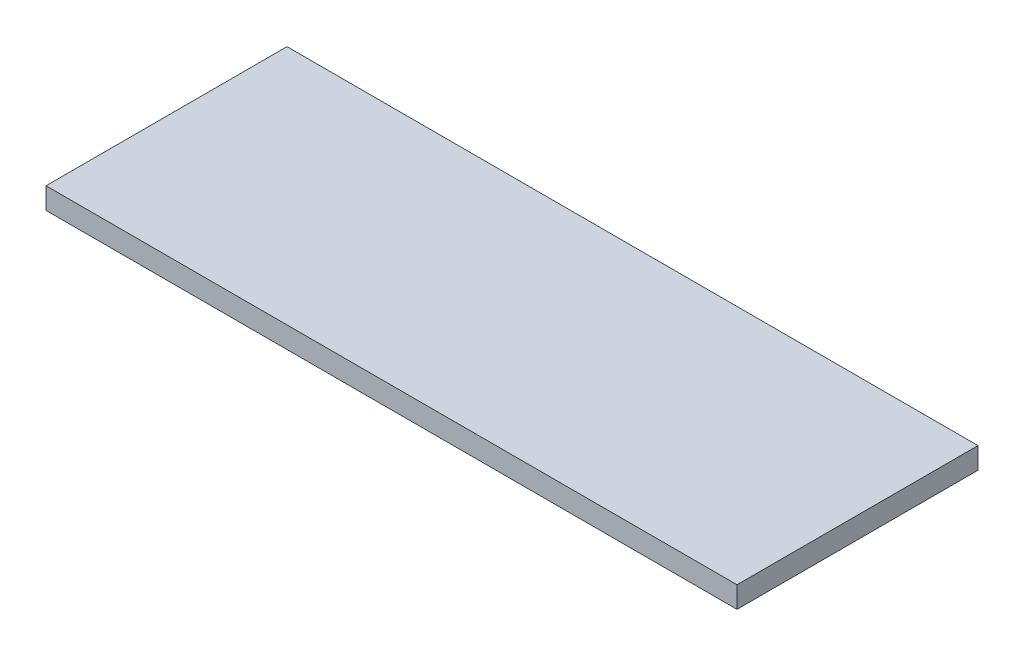
ISO-10303-21;
HEADER;
FILE_DESCRIPTION(('STEP AP214'),'2;1');
FILE_NAME('part.step','',(''),(''),'','','');
FILE_SCHEMA(('AUTOMOTIVE_DESIGN { 1 0 10303 214 1 1 1 1 }'));
ENDSEC;
DATA;
#1=APPLICATION_CONTEXT('core data for automotive mechanical design processes');
#2=APPLICATION_PROTOCOL_DEFINITION('international standard','automotive_design',2000,#1);
#3=PRODUCT_CONTEXT('',#1,'mechanical');
#4=PRODUCT('Part','Part','',(#3));
#5=PRODUCT_RELATED_PRODUCT_CATEGORY('part','',(#4));
#6=PRODUCT_DEFINITION_FORMATION('','',#4);
#7=PRODUCT_DEFINITION_CONTEXT('part definition',#1,'design');
#8=PRODUCT_DEFINITION('design','',#6,#7);
#9=PRODUCT_DEFINITION_SHAPE('','',#8);
#10=(LENGTH_UNIT() NAMED_UNIT(*) SI_UNIT(.MILLI.,.METRE.));
#11=(NAMED_UNIT(*) PLANE_ANGLE_UNIT() SI_UNIT($,.RADIAN.));
#12=(NAMED_UNIT(*) SI_UNIT($,.STERADIAN.) SOLID_ANGLE_UNIT());
#13=UNCERTAINTY_MEASURE_WITH_UNIT(LENGTH_MEASURE(1.E-05),#10,'distance_accuracy_value','');
#14=(GEOMETRIC_REPRESENTATION_CONTEXT(3) GLOBAL_UNCERTAINTY_ASSIGNED_CONTEXT((#13)) GLOBAL_UNIT_ASSIGNED_CONTEXT((#10,
#11,#12)) REPRESENTATION_CONTEXT('',''));
#15=CARTESIAN_POINT('',(0.,0.,0.));
#16=DIRECTION('',(0.,0.,1.));
#17=DIRECTION('',(1.,0.,0.));
#18=AXIS2_PLACEMENT_3D('',#15,#16,#17);
#19=CARTESIAN_POINT('',(-15.7888785046729,0.974490445680522,-4.81528037383178));
#20=DIRECTION('',(1.,0.,0.));
#21=DIRECTION('',(0.,0.,-1.));
#22=AXIS2_PLACEMENT_3D('',#19,#20,#21);
#23=PLANE('',#22);
#24=DIRECTION('',(0.,0.,1.));
#25=VECTOR('',#24,1.);
#26=CARTESIAN_POINT('',(-15.7888785046729,0.,-4.81528037383178));
#27=LINE('',#26,#25);
#28=CARTESIAN_POINT('',(-15.7888785046729,0.,-4.81528037383178));
#29=VERTEX_POINT('',#28);
#30=CARTESIAN_POINT('',(-15.7888785046729,0.,6.19471962616822));
#31=VERTEX_POINT('',#30);
#32=EDGE_CURVE('E100',#29,#31,#27,.T.);
#33=ORIENTED_EDGE('',*,*,#32,.T.);
#34=DIRECTION('',(0.,-1.,0.));
#35=VECTOR('',#34,1.);
#36=CARTESIAN_POINT('',(-15.7888785046729,0.974490445680522,6.19471962616822));
#37=LINE('',#36,#35);
#38=CARTESIAN_POINT('',(-15.7888785046729,0.974490445680522,6.19471962616822));
#39=VERTEX_POINT('',#38);
#40=EDGE_CURVE('E11',#39,#31,#37,.T.);
#41=ORIENTED_EDGE('',*,*,#40,.F.);
#42=DIRECTION('',(0.,0.,1.));
#43=VECTOR('',#42,1.);
#44=CARTESIAN_POINT('',(-15.7888785046729,0.974490445680522,-4.81528037383178));
#45=LINE('',#44,#43);
#46=CARTESIAN_POINT('',(-15.7888785046729,0.974490445680522,-4.81528037383178));
#47=VERTEX_POINT('',#46);
#48=EDGE_CURVE('E88',#47,#39,#45,.T.);
#49=ORIENTED_EDGE('',*,*,#48,.F.);
#50=DIRECTION('',(0.,-1.,0.));
#51=VECTOR('',#50,1.);
#52=CARTESIAN_POINT('',(-15.7888785046729,0.974490445680522,-4.81528037383178));
#53=LINE('',#52,#51);
#54=EDGE_CURVE('E96',#47,#29,#53,.T.);
#55=ORIENTED_EDGE('',*,*,#54,.T.);
#56=EDGE_LOOP('',(#33,#41,#49,#55));
#57=FACE_BOUND('',#56,.T.);
#58=ADVANCED_FACE('F37',(#57),#23,.F.);
#59=CARTESIAN_POINT('',(-15.7888785046729,0.974490445680522,6.19471962616822));
#60=DIRECTION('',(0.,0.,-1.));
#61=DIRECTION('',(-1.,0.,0.));
#62=AXIS2_PLACEMENT_3D('',#59,#60,#61);
#63=PLANE('',#62);
#64=DIRECTION('',(1.,0.,0.));
#65=VECTOR('',#64,1.);
#66=CARTESIAN_POINT('',(-15.7888785046729,0.,6.19471962616822));
#67=LINE('',#66,#65);
#68=CARTESIAN_POINT('',(15.7811214953271,0.,6.19471962616822));
#69=VERTEX_POINT('',#68);
#70=EDGE_CURVE('E92',#31,#69,#67,.T.);
#71=ORIENTED_EDGE('',*,*,#70,.T.);
#72=DIRECTION('',(0.,-1.,0.));
#73=VECTOR('',#72,1.);
#74=CARTESIAN_POINT('',(15.7811214953271,0.974490445680522,6.19471962616822));
#75=LINE('',#74,#73);
#76=CARTESIAN_POINT('',(15.7811214953271,0.974490445680522,6.19471962616822));
#77=VERTEX_POINT('',#76);
#78=EDGE_CURVE('E45',#77,#69,#75,.T.);
#79=ORIENTED_EDGE('',*,*,#78,.F.);
#80=DIRECTION('',(1.,0.,0.));
#81=VECTOR('',#80,1.);
#82=CARTESIAN_POINT('',(-15.7888785046729,0.974490445680522,6.19471962616822));
#83=LINE('',#82,#81);
#84=EDGE_CURVE('E83',#39,#77,#83,.T.);
#85=ORIENTED_EDGE('',*,*,#84,.F.);
#86=ORIENTED_EDGE('',*,*,#40,.T.);
#87=EDGE_LOOP('',(#71,#79,#85,#86));
#88=FACE_BOUND('',#87,.T.);
#89=ADVANCED_FACE('F91',(#88),#63,.F.);
#90=CARTESIAN_POINT('',(15.7811214953271,0.974490445680522,-4.81528037383178));
#91=DIRECTION('',(-1.,0.,0.));
#92=DIRECTION('',(0.,0.,1.));
#93=AXIS2_PLACEMENT_3D('',#90,#91,#92);
#94=PLANE('',#93);
#95=DIRECTION('',(0.,0.,-1.));
#96=VECTOR('',#95,1.);
#97=CARTESIAN_POINT('',(15.7811214953271,0.,-4.81528037383178));
#98=LINE('',#97,#96);
#99=CARTESIAN_POINT('',(15.7811214953271,0.,-4.81528037383178));
#100=VERTEX_POINT('',#99);
#101=EDGE_CURVE('E70',#69,#100,#98,.T.);
#102=ORIENTED_EDGE('',*,*,#101,.T.);
#103=DIRECTION('',(0.,-1.,0.));
#104=VECTOR('',#103,1.);
#105=CARTESIAN_POINT('',(15.7811214953271,0.974490445680522,-4.81528037383178));
#106=LINE('',#105,#104);
#107=CARTESIAN_POINT('',(15.7811214953271,0.974490445680522,-4.81528037383178));
#108=VERTEX_POINT('',#107);
#109=EDGE_CURVE('E93',#108,#100,#106,.T.);
#110=ORIENTED_EDGE('',*,*,#109,.F.);
#111=DIRECTION('',(0.,0.,-1.));
#112=VECTOR('',#111,1.);
#113=CARTESIAN_POINT('',(15.7811214953271,0.974490445680522,-4.81528037383178));
#114=LINE('',#113,#112);
#115=EDGE_CURVE('E86',#77,#108,#114,.T.);
#116=ORIENTED_EDGE('',*,*,#115,.F.);
#117=ORIENTED_EDGE('',*,*,#78,.T.);
#118=EDGE_LOOP('',(#102,#110,#116,#117));
#119=FACE_BOUND('',#118,.T.);
#120=ADVANCED_FACE('F94',(#119),#94,.F.);
#121=CARTESIAN_POINT('',(-15.7888785046729,0.974490445680522,-4.81528037383178));
#122=DIRECTION('',(0.,0.,1.));
#123=DIRECTION('',(1.,0.,0.));
#124=AXIS2_PLACEMENT_3D('',#121,#122,#123);
#125=PLANE('',#124);
#126=DIRECTION('',(-1.,0.,0.));
#127=VECTOR('',#126,1.);
#128=CARTESIAN_POINT('',(-15.7888785046729,0.,-4.81528037383178));
#129=LINE('',#128,#127);
#130=EDGE_CURVE('E76',#100,#29,#129,.T.);
#131=ORIENTED_EDGE('',*,*,#130,.T.);
#132=ORIENTED_EDGE('',*,*,#54,.F.);
#133=DIRECTION('',(-1.,0.,0.));
#134=VECTOR('',#133,1.);
#135=CARTESIAN_POINT('',(-15.7888785046729,0.974490445680522,-4.81528037383178));
#136=LINE('',#135,#134);
#137=EDGE_CURVE('E53',#108,#47,#136,.T.);
#138=ORIENTED_EDGE('',*,*,#137,.F.);
#139=ORIENTED_EDGE('',*,*,#109,.T.);
#140=EDGE_LOOP('',(#131,#132,#138,#139));
#141=FACE_BOUND('',#140,.T.);
#142=ADVANCED_FACE('F107',(#141),#125,.F.);
#143=CARTESIAN_POINT('',(0.,0.974490445680522,0.));
#144=DIRECTION('',(0.,1.,0.));
#145=DIRECTION('',(0.,0.,1.));
#146=AXIS2_PLACEMENT_3D('',#143,#144,#145);
#147=PLANE('',#146);
#148=ORIENTED_EDGE('',*,*,#48,.T.);
#149=ORIENTED_EDGE('',*,*,#84,.T.);
#150=ORIENTED_EDGE('',*,*,#115,.T.);
#151=ORIENTED_EDGE('',*,*,#137,.T.);
#152=EDGE_LOOP('',(#148,#149,#150,#151));
#153=FACE_BOUND('',#152,.T.);
#154=ADVANCED_FACE('F84',(#153),#147,.T.);
#155=CARTESIAN_POINT('',(0.,0.,0.));
#156=DIRECTION('',(0.,1.,0.));
#157=DIRECTION('',(0.,0.,1.));
#158=AXIS2_PLACEMENT_3D('',#155,#156,#157);
#159=PLANE('',#158);
#160=ORIENTED_EDGE('',*,*,#32,.F.);
#161=ORIENTED_EDGE('',*,*,#130,.F.);
#162=ORIENTED_EDGE('',*,*,#101,.F.);
#163=ORIENTED_EDGE('',*,*,#70,.F.);
#164=EDGE_LOOP('',(#160,#161,#162,#163));
#165=FACE_BOUND('',#164,.T.);
#166=ADVANCED_FACE('F110',(#165),#159,.F.);
#167=CLOSED_SHELL('',(#58,#89,#120,#142,#154,#166));
#168=MANIFOLD_SOLID_BREP('B2',#167);
#169=ADVANCED_BREP_SHAPE_REPRESENTATION('',(#18,#168),#14);
#170=SHAPE_DEFINITION_REPRESENTATION(#9,#169);
ENDSEC;
END-ISO-10303-21;
